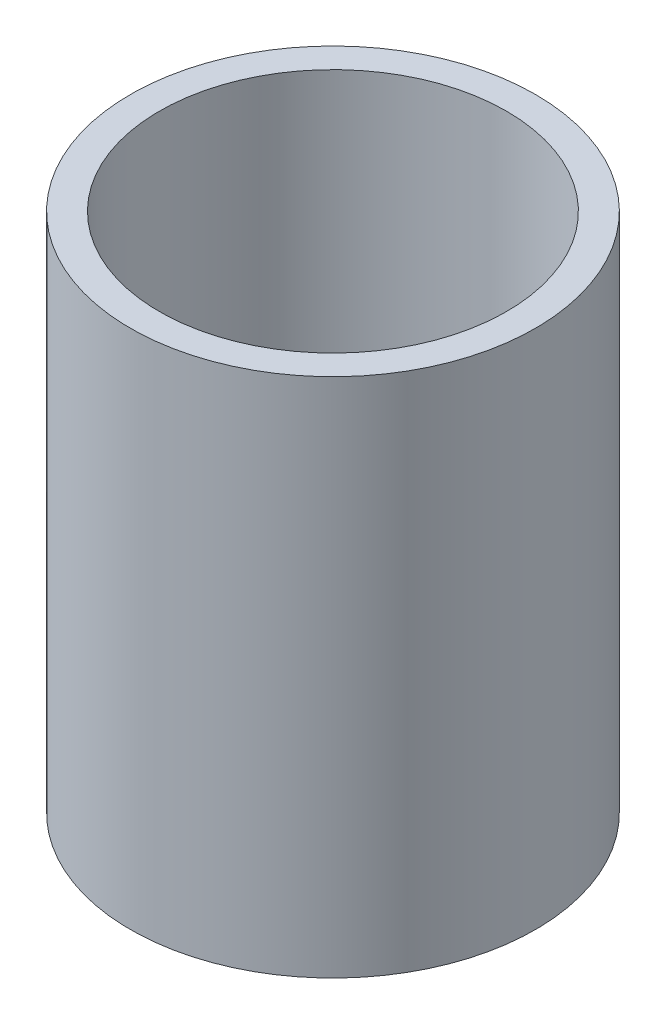
ISO-10303-21;
HEADER;
FILE_DESCRIPTION(('STEP AP214'),'2;1');
FILE_NAME('part.step','',(''),(''),'','','');
FILE_SCHEMA(('AUTOMOTIVE_DESIGN { 1 0 10303 214 1 1 1 1 }'));
ENDSEC;
DATA;
#1=APPLICATION_CONTEXT('core data for automotive mechanical design processes');
#2=APPLICATION_PROTOCOL_DEFINITION('international standard','automotive_design',2000,#1);
#3=PRODUCT_CONTEXT('',#1,'mechanical');
#4=PRODUCT('Part','Part','',(#3));
#5=PRODUCT_RELATED_PRODUCT_CATEGORY('part','',(#4));
#6=PRODUCT_DEFINITION_FORMATION('','',#4);
#7=PRODUCT_DEFINITION_CONTEXT('part definition',#1,'design');
#8=PRODUCT_DEFINITION('design','',#6,#7);
#9=PRODUCT_DEFINITION_SHAPE('','',#8);
#10=(LENGTH_UNIT() NAMED_UNIT(*) SI_UNIT(.MILLI.,.METRE.));
#11=(NAMED_UNIT(*) PLANE_ANGLE_UNIT() SI_UNIT($,.RADIAN.));
#12=(NAMED_UNIT(*) SI_UNIT($,.STERADIAN.) SOLID_ANGLE_UNIT());
#13=UNCERTAINTY_MEASURE_WITH_UNIT(LENGTH_MEASURE(1.E-05),#10,'distance_accuracy_value','');
#14=(GEOMETRIC_REPRESENTATION_CONTEXT(3) GLOBAL_UNCERTAINTY_ASSIGNED_CONTEXT((#13)) GLOBAL_UNIT_ASSIGNED_CONTEXT((#10,
#11,#12)) REPRESENTATION_CONTEXT('',''));
#15=CARTESIAN_POINT('',(0.,0.,0.));
#16=DIRECTION('',(0.,0.,1.));
#17=DIRECTION('',(1.,0.,0.));
#18=AXIS2_PLACEMENT_3D('',#15,#16,#17);
#19=CARTESIAN_POINT('',(0.,180.,0.));
#20=DIRECTION('',(0.,-1.,0.));
#21=DIRECTION('',(0.,0.,-1.));
#22=AXIS2_PLACEMENT_3D('',#19,#20,#21);
#23=CYLINDRICAL_SURFACE('',#22,70.);
#24=CARTESIAN_POINT('',(0.,180.,0.));
#25=DIRECTION('',(0.,1.,0.));
#26=DIRECTION('',(0.,0.,1.));
#27=AXIS2_PLACEMENT_3D('',#24,#25,#26);
#28=CIRCLE('',#27,70.);
#29=CARTESIAN_POINT('',(0.,180.,-70.));
#30=VERTEX_POINT('',#29);
#31=EDGE_CURVE('E11',#30,#30,#28,.T.);
#32=CARTESIAN_POINT('',(0.,0.,0.));
#33=DIRECTION('',(0.,1.,0.));
#34=DIRECTION('',(0.,0.,1.));
#35=AXIS2_PLACEMENT_3D('',#32,#33,#34);
#36=CIRCLE('',#35,70.);
#37=CARTESIAN_POINT('',(0.,0.,-70.));
#38=VERTEX_POINT('',#37);
#39=EDGE_CURVE('E45',#38,#38,#36,.T.);
#40=CARTESIAN_POINT('',(0.,180.,-70.));
#41=CARTESIAN_POINT('',(0.,178.125,-70.));
#42=CARTESIAN_POINT('',(0.,176.25,-70.));
#43=CARTESIAN_POINT('',(0.,172.5,-70.));
#44=CARTESIAN_POINT('',(0.,170.625,-70.));
#45=CARTESIAN_POINT('',(0.,166.875,-70.));
#46=CARTESIAN_POINT('',(0.,165.,-70.));
#47=CARTESIAN_POINT('',(0.,161.25,-70.));
#48=CARTESIAN_POINT('',(0.,159.375,-70.));
#49=CARTESIAN_POINT('',(0.,155.625,-70.));
#50=CARTESIAN_POINT('',(0.,153.75,-70.));
#51=CARTESIAN_POINT('',(0.,150.,-70.));
#52=CARTESIAN_POINT('',(0.,148.125,-70.));
#53=CARTESIAN_POINT('',(0.,144.375,-70.));
#54=CARTESIAN_POINT('',(0.,142.5,-70.));
#55=CARTESIAN_POINT('',(0.,138.75,-70.));
#56=CARTESIAN_POINT('',(0.,136.875,-70.));
#57=CARTESIAN_POINT('',(0.,133.125,-70.));
#58=CARTESIAN_POINT('',(0.,131.25,-70.));
#59=CARTESIAN_POINT('',(0.,127.5,-70.));
#60=CARTESIAN_POINT('',(0.,125.625,-70.));
#61=CARTESIAN_POINT('',(0.,121.875,-70.));
#62=CARTESIAN_POINT('',(0.,120.,-70.));
#63=CARTESIAN_POINT('',(0.,116.25,-70.));
#64=CARTESIAN_POINT('',(0.,114.375,-70.));
#65=CARTESIAN_POINT('',(0.,110.625,-70.));
#66=CARTESIAN_POINT('',(0.,108.75,-70.));
#67=CARTESIAN_POINT('',(0.,105.,-70.));
#68=CARTESIAN_POINT('',(0.,103.125,-70.));
#69=CARTESIAN_POINT('',(0.,99.375,-70.));
#70=CARTESIAN_POINT('',(0.,97.5,-70.));
#71=CARTESIAN_POINT('',(0.,93.75,-70.));
#72=CARTESIAN_POINT('',(0.,91.875,-70.));
#73=CARTESIAN_POINT('',(0.,88.125,-70.));
#74=CARTESIAN_POINT('',(0.,86.25,-70.));
#75=CARTESIAN_POINT('',(0.,82.5,-70.));
#76=CARTESIAN_POINT('',(0.,80.625,-70.));
#77=CARTESIAN_POINT('',(0.,76.875,-70.));
#78=CARTESIAN_POINT('',(0.,75.,-70.));
#79=CARTESIAN_POINT('',(0.,71.25,-70.));
#80=CARTESIAN_POINT('',(0.,69.375,-70.));
#81=CARTESIAN_POINT('',(0.,65.625,-70.));
#82=CARTESIAN_POINT('',(0.,63.75,-70.));
#83=CARTESIAN_POINT('',(0.,60.,-70.));
#84=CARTESIAN_POINT('',(0.,58.125,-70.));
#85=CARTESIAN_POINT('',(0.,54.375,-70.));
#86=CARTESIAN_POINT('',(0.,52.5,-70.));
#87=CARTESIAN_POINT('',(0.,48.75,-70.));
#88=CARTESIAN_POINT('',(0.,46.875,-70.));
#89=CARTESIAN_POINT('',(0.,43.125,-70.));
#90=CARTESIAN_POINT('',(0.,41.25,-70.));
#91=CARTESIAN_POINT('',(0.,37.5,-70.));
#92=CARTESIAN_POINT('',(0.,35.625,-70.));
#93=CARTESIAN_POINT('',(0.,31.875,-70.));
#94=CARTESIAN_POINT('',(0.,30.,-70.));
#95=CARTESIAN_POINT('',(0.,26.25,-70.));
#96=CARTESIAN_POINT('',(0.,24.375,-70.));
#97=CARTESIAN_POINT('',(0.,20.625,-70.));
#98=CARTESIAN_POINT('',(0.,18.75,-70.));
#99=CARTESIAN_POINT('',(0.,15.,-70.));
#100=CARTESIAN_POINT('',(0.,13.125,-70.));
#101=CARTESIAN_POINT('',(0.,9.37499999999998,-70.));
#102=CARTESIAN_POINT('',(0.,7.49999999999997,-70.));
#103=CARTESIAN_POINT('',(0.,3.74999999999997,-70.));
#104=CARTESIAN_POINT('',(0.,1.87499999999997,-70.));
#105=CARTESIAN_POINT('',(0.,0.,-70.));
#106=B_SPLINE_CURVE_WITH_KNOTS('',3,(#40,#41,#42,#43,#44,#45,#46,#47,#48,#49,#50,#51,#52,#53,
#54,#55,#56,#57,#58,#59,#60,#61,#62,#63,#64,#65,#66,#67,#68,#69,#70,#71,#72,#73,#74,#75,#76,#77,
#78,#79,#80,#81,#82,#83,#84,#85,#86,#87,#88,#89,#90,#91,#92,#93,#94,#95,#96,#97,#98,#99,#100,
#101,#102,#103,#104,#105),.UNSPECIFIED.,.F.,.F.,(4,2,2,2,2,2,2,2,2,2,2,2,2,2,2,2,2,2,2,2,2,2,2,
2,2,2,2,2,2,2,2,2,4),(0.,5.62499999999999,11.25,16.875,22.5,28.125,33.75,39.375,45.,50.625,
56.25,61.875,67.5,73.125,78.75,84.375,90.,95.625,101.25,106.875,112.5,118.125,123.75,129.375,
135.,140.625,146.25,151.875,157.5,163.125,168.75,174.375,180.),.UNSPECIFIED.);
#107=EDGE_CURVE('BSEAM42',#30,#38,#106,.T.);
#108=ORIENTED_EDGE('',*,*,#31,.F.);
#109=ORIENTED_EDGE('',*,*,#39,.T.);
#110=ORIENTED_EDGE('',*,*,#107,.T.);
#111=ORIENTED_EDGE('',*,*,#107,.F.);
#112=EDGE_LOOP('',(#108,#110,#109,#111));
#113=FACE_BOUND('',#112,.T.);
#114=ADVANCED_FACE('F42',(#113),#23,.T.);
#115=CARTESIAN_POINT('',(0.,180.,0.));
#116=DIRECTION('',(0.,1.,0.));
#117=DIRECTION('',(0.,0.,1.));
#118=AXIS2_PLACEMENT_3D('',#115,#116,#117);
#119=PLANE('',#118);
#120=CARTESIAN_POINT('',(0.,180.,0.));
#121=DIRECTION('',(0.,1.,0.));
#122=DIRECTION('',(0.,0.,1.));
#123=AXIS2_PLACEMENT_3D('',#120,#121,#122);
#124=CIRCLE('',#123,60.);
#125=CARTESIAN_POINT('',(0.,180.,-60.));
#126=VERTEX_POINT('',#125);
#127=EDGE_CURVE('E55',#126,#126,#124,.F.);
#128=ORIENTED_EDGE('',*,*,#127,.T.);
#129=EDGE_LOOP('',(#128));
#130=FACE_BOUND('',#129,.T.);
#131=ORIENTED_EDGE('',*,*,#31,.T.);
#132=EDGE_LOOP('',(#131));
#133=FACE_BOUND('',#132,.T.);
#134=ADVANCED_FACE('F77',(#130,#133),#119,.T.);
#135=CARTESIAN_POINT('',(0.,0.,0.));
#136=DIRECTION('',(0.,1.,0.));
#137=DIRECTION('',(0.,0.,1.));
#138=AXIS2_PLACEMENT_3D('',#135,#136,#137);
#139=PLANE('',#138);
#140=CARTESIAN_POINT('',(0.,0.,0.));
#141=DIRECTION('',(0.,1.,0.));
#142=DIRECTION('',(0.,0.,1.));
#143=AXIS2_PLACEMENT_3D('',#140,#141,#142);
#144=CIRCLE('',#143,60.);
#145=CARTESIAN_POINT('',(0.,0.,-60.));
#146=VERTEX_POINT('',#145);
#147=EDGE_CURVE('E61',#146,#146,#144,.T.);
#148=ORIENTED_EDGE('',*,*,#147,.T.);
#149=EDGE_LOOP('',(#148));
#150=FACE_BOUND('',#149,.T.);
#151=ORIENTED_EDGE('',*,*,#39,.F.);
#152=EDGE_LOOP('',(#151));
#153=FACE_BOUND('',#152,.T.);
#154=ADVANCED_FACE('F67',(#150,#153),#139,.F.);
#155=CARTESIAN_POINT('',(0.,360.,0.));
#156=DIRECTION('',(0.,-1.,0.));
#157=DIRECTION('',(0.,0.,-1.));
#158=AXIS2_PLACEMENT_3D('',#155,#156,#157);
#159=CYLINDRICAL_SURFACE('',#158,60.);
#160=CARTESIAN_POINT('',(0.,180.,-60.));
#161=CARTESIAN_POINT('',(0.,178.125,-60.));
#162=CARTESIAN_POINT('',(0.,176.25,-60.));
#163=CARTESIAN_POINT('',(0.,172.5,-60.));
#164=CARTESIAN_POINT('',(0.,170.625,-60.));
#165=CARTESIAN_POINT('',(0.,166.875,-60.));
#166=CARTESIAN_POINT('',(0.,165.,-60.));
#167=CARTESIAN_POINT('',(0.,161.25,-60.));
#168=CARTESIAN_POINT('',(0.,159.375,-60.));
#169=CARTESIAN_POINT('',(0.,155.625,-60.));
#170=CARTESIAN_POINT('',(0.,153.75,-60.));
#171=CARTESIAN_POINT('',(0.,150.,-60.));
#172=CARTESIAN_POINT('',(0.,148.125,-60.));
#173=CARTESIAN_POINT('',(0.,144.375,-60.));
#174=CARTESIAN_POINT('',(0.,142.5,-60.));
#175=CARTESIAN_POINT('',(0.,138.75,-60.));
#176=CARTESIAN_POINT('',(0.,136.875,-60.));
#177=CARTESIAN_POINT('',(0.,133.125,-60.));
#178=CARTESIAN_POINT('',(0.,131.25,-60.));
#179=CARTESIAN_POINT('',(0.,127.5,-60.));
#180=CARTESIAN_POINT('',(0.,125.625,-60.));
#181=CARTESIAN_POINT('',(0.,121.875,-60.));
#182=CARTESIAN_POINT('',(0.,120.,-60.));
#183=CARTESIAN_POINT('',(0.,116.25,-60.));
#184=CARTESIAN_POINT('',(0.,114.375,-60.));
#185=CARTESIAN_POINT('',(0.,110.625,-60.));
#186=CARTESIAN_POINT('',(0.,108.75,-60.));
#187=CARTESIAN_POINT('',(0.,105.,-60.));
#188=CARTESIAN_POINT('',(0.,103.125,-60.));
#189=CARTESIAN_POINT('',(0.,99.375,-60.));
#190=CARTESIAN_POINT('',(0.,97.5,-60.));
#191=CARTESIAN_POINT('',(0.,93.75,-60.));
#192=CARTESIAN_POINT('',(0.,91.875,-60.));
#193=CARTESIAN_POINT('',(0.,88.125,-60.));
#194=CARTESIAN_POINT('',(0.,86.25,-60.));
#195=CARTESIAN_POINT('',(0.,82.5,-60.));
#196=CARTESIAN_POINT('',(0.,80.6249999999999,-60.));
#197=CARTESIAN_POINT('',(0.,76.8749999999999,-60.));
#198=CARTESIAN_POINT('',(0.,74.9999999999999,-60.));
#199=CARTESIAN_POINT('',(0.,71.2499999999999,-60.));
#200=CARTESIAN_POINT('',(0.,69.375,-60.));
#201=CARTESIAN_POINT('',(0.,65.6249999999999,-60.));
#202=CARTESIAN_POINT('',(0.,63.75,-60.));
#203=CARTESIAN_POINT('',(0.,60.,-60.));
#204=CARTESIAN_POINT('',(0.,58.125,-60.));
#205=CARTESIAN_POINT('',(0.,54.375,-60.));
#206=CARTESIAN_POINT('',(0.,52.5,-60.));
#207=CARTESIAN_POINT('',(0.,48.75,-60.));
#208=CARTESIAN_POINT('',(0.,46.875,-60.));
#209=CARTESIAN_POINT('',(0.,43.125,-60.));
#210=CARTESIAN_POINT('',(0.,41.25,-60.));
#211=CARTESIAN_POINT('',(0.,37.5,-60.));
#212=CARTESIAN_POINT('',(0.,35.625,-60.));
#213=CARTESIAN_POINT('',(0.,31.875,-60.));
#214=CARTESIAN_POINT('',(0.,30.,-60.));
#215=CARTESIAN_POINT('',(0.,26.25,-60.));
#216=CARTESIAN_POINT('',(0.,24.375,-60.));
#217=CARTESIAN_POINT('',(0.,20.625,-60.));
#218=CARTESIAN_POINT('',(0.,18.7499999999999,-60.));
#219=CARTESIAN_POINT('',(0.,14.9999999999999,-60.));
#220=CARTESIAN_POINT('',(0.,13.1249999999999,-60.));
#221=CARTESIAN_POINT('',(0.,9.37499999999993,-60.));
#222=CARTESIAN_POINT('',(0.,7.49999999999993,-60.));
#223=CARTESIAN_POINT('',(0.,3.74999999999994,-60.));
#224=CARTESIAN_POINT('',(0.,1.87499999999994,-60.));
#225=CARTESIAN_POINT('',(0.,0.,-60.));
#226=B_SPLINE_CURVE_WITH_KNOTS('',3,(#160,#161,#162,#163,#164,#165,#166,#167,#168,#169,#170,
#171,#172,#173,#174,#175,#176,#177,#178,#179,#180,#181,#182,#183,#184,#185,#186,#187,#188,#189,
#190,#191,#192,#193,#194,#195,#196,#197,#198,#199,#200,#201,#202,#203,#204,#205,#206,#207,#208,
#209,#210,#211,#212,#213,#214,#215,#216,#217,#218,#219,#220,#221,#222,#223,#224,#225),
.UNSPECIFIED.,.F.,.F.,(4,2,2,2,2,2,2,2,2,2,2,2,2,2,2,2,2,2,2,2,2,2,2,2,2,2,2,2,2,2,2,2,4),(0.,
5.62499999999999,11.25,16.875,22.5,28.125,33.75,39.375,45.,50.625,56.25,61.875,67.5,73.125,
78.75,84.375,90.,95.625,101.25,106.875,112.5,118.125,123.75,129.375,135.,140.625,146.25,151.875,
157.5,163.125,168.75,174.375,180.),.UNSPECIFIED.);
#227=EDGE_CURVE('BSEAM70',#126,#146,#226,.T.);
#228=ORIENTED_EDGE('',*,*,#127,.F.);
#229=ORIENTED_EDGE('',*,*,#147,.F.);
#230=ORIENTED_EDGE('',*,*,#227,.T.);
#231=ORIENTED_EDGE('',*,*,#227,.F.);
#232=EDGE_LOOP('',(#228,#230,#229,#231));
#233=FACE_BOUND('',#232,.T.);
#234=ADVANCED_FACE('F70',(#233),#159,.F.);
#235=CLOSED_SHELL('',(#114,#134,#154,#234));
#236=MANIFOLD_SOLID_BREP('B2',#235);
#237=ADVANCED_BREP_SHAPE_REPRESENTATION('',(#18,#236),#14);
#238=SHAPE_DEFINITION_REPRESENTATION(#9,#237);
ENDSEC;
END-ISO-10303-21;
